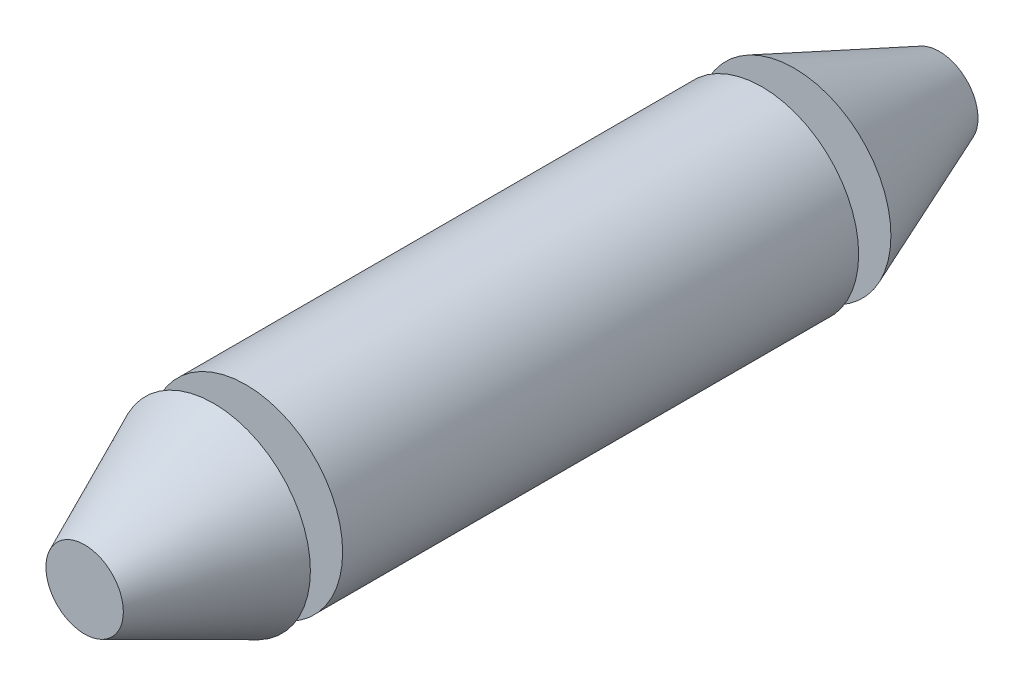
ISO-10303-21;
HEADER;
FILE_DESCRIPTION(('STEP AP214'),'2;1');
FILE_NAME('part.step','',(''),(''),'','','');
FILE_SCHEMA(('AUTOMOTIVE_DESIGN { 1 0 10303 214 1 1 1 1 }'));
ENDSEC;
DATA;
#1=APPLICATION_CONTEXT('core data for automotive mechanical design processes');
#2=APPLICATION_PROTOCOL_DEFINITION('international standard','automotive_design',2000,#1);
#3=PRODUCT_CONTEXT('',#1,'mechanical');
#4=PRODUCT('Part','Part','',(#3));
#5=PRODUCT_RELATED_PRODUCT_CATEGORY('part','',(#4));
#6=PRODUCT_DEFINITION_FORMATION('','',#4);
#7=PRODUCT_DEFINITION_CONTEXT('part definition',#1,'design');
#8=PRODUCT_DEFINITION('design','',#6,#7);
#9=PRODUCT_DEFINITION_SHAPE('','',#8);
#10=(LENGTH_UNIT() NAMED_UNIT(*) SI_UNIT(.MILLI.,.METRE.));
#11=(NAMED_UNIT(*) PLANE_ANGLE_UNIT() SI_UNIT($,.RADIAN.));
#12=(NAMED_UNIT(*) SI_UNIT($,.STERADIAN.) SOLID_ANGLE_UNIT());
#13=UNCERTAINTY_MEASURE_WITH_UNIT(LENGTH_MEASURE(1.E-05),#10,'distance_accuracy_value','');
#14=(GEOMETRIC_REPRESENTATION_CONTEXT(3) GLOBAL_UNCERTAINTY_ASSIGNED_CONTEXT((#13)) GLOBAL_UNIT_ASSIGNED_CONTEXT((#10,
#11,#12)) REPRESENTATION_CONTEXT('',''));
#15=CARTESIAN_POINT('',(0.,0.,0.));
#16=DIRECTION('',(0.,0.,1.));
#17=DIRECTION('',(1.,0.,0.));
#18=AXIS2_PLACEMENT_3D('',#15,#16,#17);
#19=CARTESIAN_POINT('',(0.,0.,0.));
#20=DIRECTION('',(0.,0.,1.));
#21=DIRECTION('',(1.,0.,0.));
#22=AXIS2_PLACEMENT_3D('',#19,#20,#21);
#23=PLANE('',#22);
#24=CARTESIAN_POINT('',(0.,0.,0.));
#25=DIRECTION('',(0.,0.,1.));
#26=DIRECTION('',(1.,0.,0.));
#27=AXIS2_PLACEMENT_3D('',#24,#25,#26);
#28=CIRCLE('',#27,3.);
#29=CARTESIAN_POINT('',(3.,0.,0.));
#30=VERTEX_POINT('',#29);
#31=EDGE_CURVE('E53',#30,#30,#28,.T.);
#32=ORIENTED_EDGE('',*,*,#31,.F.);
#33=EDGE_LOOP('',(#32));
#34=FACE_BOUND('',#33,.T.);
#35=CARTESIAN_POINT('',(0.,0.,0.));
#36=DIRECTION('',(0.,0.,1.));
#37=DIRECTION('',(1.,0.,0.));
#38=AXIS2_PLACEMENT_3D('',#35,#36,#37);
#39=CIRCLE('',#38,1.2);
#40=CARTESIAN_POINT('',(1.2,0.,0.));
#41=VERTEX_POINT('',#40);
#42=EDGE_CURVE('E12',#41,#41,#39,.F.);
#43=ORIENTED_EDGE('',*,*,#42,.F.);
#44=EDGE_LOOP('',(#43));
#45=FACE_BOUND('',#44,.T.);
#46=ADVANCED_FACE('F40',(#34,#45),#23,.F.);
#47=CARTESIAN_POINT('',(0.,0.,16.));
#48=DIRECTION('',(0.,0.,1.));
#49=DIRECTION('',(1.,0.,0.));
#50=AXIS2_PLACEMENT_3D('',#47,#48,#49);
#51=PLANE('',#50);
#52=CARTESIAN_POINT('',(0.,0.,16.));
#53=DIRECTION('',(0.,0.,1.));
#54=DIRECTION('',(1.,0.,0.));
#55=AXIS2_PLACEMENT_3D('',#52,#53,#54);
#56=CIRCLE('',#55,3.);
#57=CARTESIAN_POINT('',(3.,0.,16.));
#58=VERTEX_POINT('',#57);
#59=EDGE_CURVE('E48',#58,#58,#56,.T.);
#60=ORIENTED_EDGE('',*,*,#59,.T.);
#61=EDGE_LOOP('',(#60));
#62=FACE_BOUND('',#61,.T.);
#63=CARTESIAN_POINT('',(0.,0.,16.));
#64=DIRECTION('',(0.,0.,1.));
#65=DIRECTION('',(1.,0.,0.));
#66=AXIS2_PLACEMENT_3D('',#63,#64,#65);
#67=CIRCLE('',#66,1.2);
#68=CARTESIAN_POINT('',(1.2,0.,16.));
#69=VERTEX_POINT('',#68);
#70=EDGE_CURVE('E58',#69,#69,#67,.T.);
#71=ORIENTED_EDGE('',*,*,#70,.F.);
#72=EDGE_LOOP('',(#71));
#73=FACE_BOUND('',#72,.T.);
#74=ADVANCED_FACE('F97',(#62,#73),#51,.T.);
#75=CARTESIAN_POINT('',(0.,0.,16.));
#76=DIRECTION('',(0.,0.,-1.));
#77=DIRECTION('',(-1.,0.,0.));
#78=AXIS2_PLACEMENT_3D('',#75,#76,#77);
#79=CYLINDRICAL_SURFACE('',#78,3.);
#80=ORIENTED_EDGE('',*,*,#59,.F.);
#81=EDGE_LOOP('',(#80));
#82=FACE_BOUND('',#81,.T.);
#83=ORIENTED_EDGE('',*,*,#31,.T.);
#84=EDGE_LOOP('',(#83));
#85=FACE_BOUND('',#84,.T.);
#86=ADVANCED_FACE('F42',(#82,#85),#79,.T.);
#87=CARTESIAN_POINT('',(0.,0.,21.));
#88=DIRECTION('',(0.,0.,-1.));
#89=DIRECTION('',(-1.,0.,0.));
#90=AXIS2_PLACEMENT_3D('',#87,#88,#89);
#91=CYLINDRICAL_SURFACE('',#90,1.2);
#92=CARTESIAN_POINT('',(0.,0.,17.));
#93=DIRECTION('',(0.,0.,-1.));
#94=DIRECTION('',(-1.,0.,0.));
#95=AXIS2_PLACEMENT_3D('',#92,#93,#94);
#96=CIRCLE('',#95,1.2);
#97=CARTESIAN_POINT('',(-1.2,0.,17.));
#98=VERTEX_POINT('',#97);
#99=EDGE_CURVE('E44',#98,#98,#96,.T.);
#100=ORIENTED_EDGE('',*,*,#99,.T.);
#101=EDGE_LOOP('',(#100));
#102=FACE_BOUND('',#101,.T.);
#103=ORIENTED_EDGE('',*,*,#70,.T.);
#104=EDGE_LOOP('',(#103));
#105=FACE_BOUND('',#104,.T.);
#106=ADVANCED_FACE('F90',(#102,#105),#91,.T.);
#107=CARTESIAN_POINT('',(0.,0.,-5.5));
#108=DIRECTION('',(0.,0.,1.));
#109=DIRECTION('',(1.,0.,0.));
#110=AXIS2_PLACEMENT_3D('',#107,#108,#109);
#111=CYLINDRICAL_SURFACE('',#110,1.2);
#112=CARTESIAN_POINT('',(0.,0.,-1.));
#113=DIRECTION('',(0.,0.,1.));
#114=DIRECTION('',(1.,0.,0.));
#115=AXIS2_PLACEMENT_3D('',#112,#113,#114);
#116=CIRCLE('',#115,1.2);
#117=CARTESIAN_POINT('',(1.2,0.,-1.));
#118=VERTEX_POINT('',#117);
#119=EDGE_CURVE('E56',#118,#118,#116,.T.);
#120=ORIENTED_EDGE('',*,*,#119,.T.);
#121=EDGE_LOOP('',(#120));
#122=FACE_BOUND('',#121,.T.);
#123=ORIENTED_EDGE('',*,*,#42,.T.);
#124=EDGE_LOOP('',(#123));
#125=FACE_BOUND('',#124,.T.);
#126=ADVANCED_FACE('F93',(#122,#125),#111,.T.);
#127=CARTESIAN_POINT('',(0.,0.,-1.));
#128=DIRECTION('',(0.,0.,1.));
#129=DIRECTION('',(1.,0.,0.));
#130=AXIS2_PLACEMENT_3D('',#127,#128,#129);
#131=PLANE('',#130);
#132=CARTESIAN_POINT('',(0.,0.,-1.));
#133=DIRECTION('',(0.,0.,1.));
#134=DIRECTION('',(1.,0.,0.));
#135=AXIS2_PLACEMENT_3D('',#132,#133,#134);
#136=CIRCLE('',#135,3.);
#137=CARTESIAN_POINT('',(3.,0.,-1.));
#138=VERTEX_POINT('',#137);
#139=EDGE_CURVE('E59',#138,#138,#136,.T.);
#140=ORIENTED_EDGE('',*,*,#139,.T.);
#141=EDGE_LOOP('',(#140));
#142=FACE_BOUND('',#141,.T.);
#143=ORIENTED_EDGE('',*,*,#119,.F.);
#144=EDGE_LOOP('',(#143));
#145=FACE_BOUND('',#144,.T.);
#146=ADVANCED_FACE('F114',(#142,#145),#131,.T.);
#147=CARTESIAN_POINT('',(0.,0.,-1.));
#148=DIRECTION('',(0.,0.,1.));
#149=DIRECTION('',(1.,0.,0.));
#150=AXIS2_PLACEMENT_3D('',#147,#148,#149);
#151=CONICAL_SURFACE('',#150,3.,0.380506377112365);
#152=CARTESIAN_POINT('',(0.,0.,-5.5));
#153=DIRECTION('',(0.,0.,1.));
#154=DIRECTION('',(1.,0.,0.));
#155=AXIS2_PLACEMENT_3D('',#152,#153,#154);
#156=CIRCLE('',#155,1.2);
#157=CARTESIAN_POINT('',(1.2,0.,-5.5));
#158=VERTEX_POINT('',#157);
#159=EDGE_CURVE('E65',#158,#158,#156,.T.);
#160=ORIENTED_EDGE('',*,*,#159,.T.);
#161=EDGE_LOOP('',(#160));
#162=FACE_BOUND('',#161,.T.);
#163=ORIENTED_EDGE('',*,*,#139,.F.);
#164=EDGE_LOOP('',(#163));
#165=FACE_BOUND('',#164,.T.);
#166=ADVANCED_FACE('F117',(#162,#165),#151,.T.);
#167=CARTESIAN_POINT('',(0.,0.,-5.5));
#168=DIRECTION('',(0.,0.,-1.));
#169=DIRECTION('',(-1.,0.,0.));
#170=AXIS2_PLACEMENT_3D('',#167,#168,#169);
#171=PLANE('',#170);
#172=ORIENTED_EDGE('',*,*,#159,.F.);
#173=EDGE_LOOP('',(#172));
#174=FACE_BOUND('',#173,.T.);
#175=ADVANCED_FACE('F85',(#174),#171,.T.);
#176=CARTESIAN_POINT('',(3.,0.,17.));
#177=DIRECTION('',(0.,0.,-1.));
#178=DIRECTION('',(-1.,0.,0.));
#179=AXIS2_PLACEMENT_3D('',#176,#177,#178);
#180=PLANE('',#179);
#181=CARTESIAN_POINT('',(0.,0.,17.));
#182=DIRECTION('',(0.,0.,1.));
#183=DIRECTION('',(1.,0.,0.));
#184=AXIS2_PLACEMENT_3D('',#181,#182,#183);
#185=CIRCLE('',#184,3.);
#186=CARTESIAN_POINT('',(3.,0.,17.));
#187=VERTEX_POINT('',#186);
#188=EDGE_CURVE('E75',#187,#187,#185,.T.);
#189=ORIENTED_EDGE('',*,*,#188,.F.);
#190=EDGE_LOOP('',(#189));
#191=FACE_BOUND('',#190,.T.);
#192=ORIENTED_EDGE('',*,*,#99,.F.);
#193=EDGE_LOOP('',(#192));
#194=FACE_BOUND('',#193,.T.);
#195=ADVANCED_FACE('F82',(#191,#194),#180,.T.);
#196=CARTESIAN_POINT('',(0.,0.,21.));
#197=DIRECTION('',(0.,0.,-1.));
#198=DIRECTION('',(-1.,0.,0.));
#199=AXIS2_PLACEMENT_3D('',#196,#197,#198);
#200=CONICAL_SURFACE('',#199,1.2,0.422853926132941);
#201=ORIENTED_EDGE('',*,*,#188,.T.);
#202=EDGE_LOOP('',(#201));
#203=FACE_BOUND('',#202,.T.);
#204=CARTESIAN_POINT('',(0.,0.,21.));
#205=DIRECTION('',(0.,0.,1.));
#206=DIRECTION('',(1.,0.,0.));
#207=AXIS2_PLACEMENT_3D('',#204,#205,#206);
#208=CIRCLE('',#207,1.2);
#209=CARTESIAN_POINT('',(1.2,0.,21.));
#210=VERTEX_POINT('',#209);
#211=EDGE_CURVE('E72',#210,#210,#208,.T.);
#212=ORIENTED_EDGE('',*,*,#211,.F.);
#213=EDGE_LOOP('',(#212));
#214=FACE_BOUND('',#213,.T.);
#215=ADVANCED_FACE('F79',(#203,#214),#200,.T.);
#216=CARTESIAN_POINT('',(0.,0.,21.));
#217=DIRECTION('',(0.,0.,1.));
#218=DIRECTION('',(1.,0.,0.));
#219=AXIS2_PLACEMENT_3D('',#216,#217,#218);
#220=PLANE('',#219);
#221=ORIENTED_EDGE('',*,*,#211,.T.);
#222=EDGE_LOOP('',(#221));
#223=FACE_BOUND('',#222,.T.);
#224=ADVANCED_FACE('F108',(#223),#220,.T.);
#225=CLOSED_SHELL('',(#46,#74,#86,#106,#126,#146,#166,#175,#195,#215,#224));
#226=MANIFOLD_SOLID_BREP('B2',#225);
#227=ADVANCED_BREP_SHAPE_REPRESENTATION('',(#18,#226),#14);
#228=SHAPE_DEFINITION_REPRESENTATION(#9,#227);
ENDSEC;
END-ISO-10303-21;
